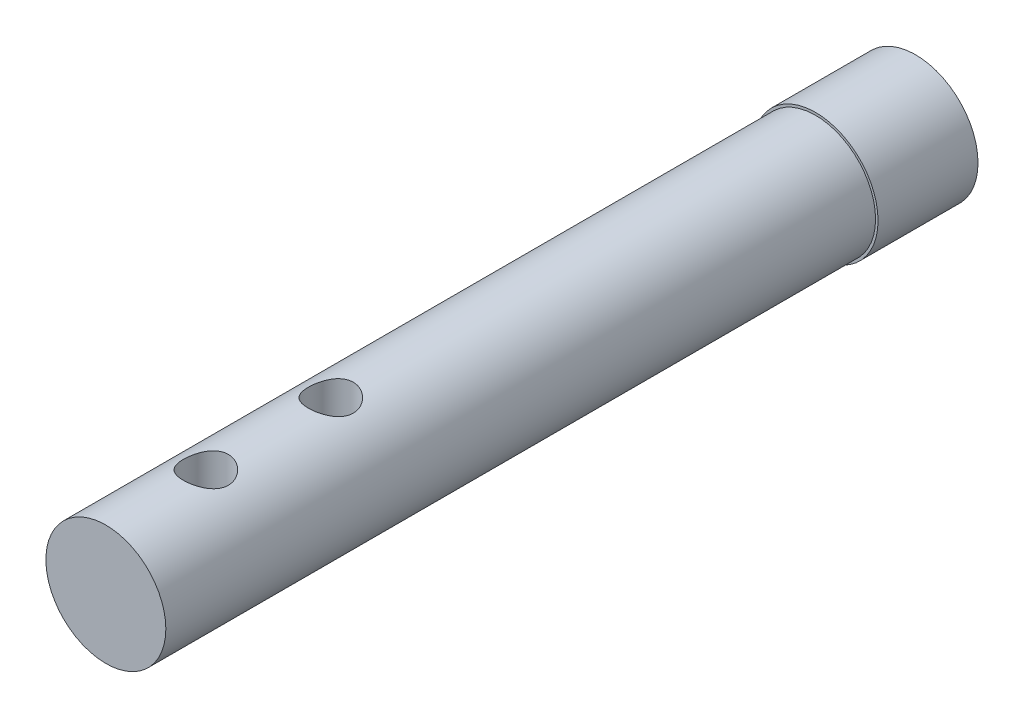
ISO-10303-21;
HEADER;
FILE_DESCRIPTION(('STEP AP214'),'2;1');
FILE_NAME('part.step','',(''),(''),'','','');
FILE_SCHEMA(('AUTOMOTIVE_DESIGN { 1 0 10303 214 1 1 1 1 }'));
ENDSEC;
DATA;
#1=APPLICATION_CONTEXT('core data for automotive mechanical design processes');
#2=APPLICATION_PROTOCOL_DEFINITION('international standard','automotive_design',2000,#1);
#3=PRODUCT_CONTEXT('',#1,'mechanical');
#4=PRODUCT('Part','Part','',(#3));
#5=PRODUCT_RELATED_PRODUCT_CATEGORY('part','',(#4));
#6=PRODUCT_DEFINITION_FORMATION('','',#4);
#7=PRODUCT_DEFINITION_CONTEXT('part definition',#1,'design');
#8=PRODUCT_DEFINITION('design','',#6,#7);
#9=PRODUCT_DEFINITION_SHAPE('','',#8);
#10=(LENGTH_UNIT() NAMED_UNIT(*) SI_UNIT(.MILLI.,.METRE.));
#11=(NAMED_UNIT(*) PLANE_ANGLE_UNIT() SI_UNIT($,.RADIAN.));
#12=(NAMED_UNIT(*) SI_UNIT($,.STERADIAN.) SOLID_ANGLE_UNIT());
#13=UNCERTAINTY_MEASURE_WITH_UNIT(LENGTH_MEASURE(1.E-05),#10,'distance_accuracy_value','');
#14=(GEOMETRIC_REPRESENTATION_CONTEXT(3) GLOBAL_UNCERTAINTY_ASSIGNED_CONTEXT((#13)) GLOBAL_UNIT_ASSIGNED_CONTEXT((#10,
#11,#12)) REPRESENTATION_CONTEXT('',''));
#15=CARTESIAN_POINT('',(0.,0.,0.));
#16=DIRECTION('',(0.,0.,1.));
#17=DIRECTION('',(1.,0.,0.));
#18=AXIS2_PLACEMENT_3D('',#15,#16,#17);
#19=CARTESIAN_POINT('',(0.,0.,35.));
#20=DIRECTION('',(0.,0.,-1.));
#21=DIRECTION('',(-1.,0.,0.));
#22=AXIS2_PLACEMENT_3D('',#19,#20,#21);
#23=CYLINDRICAL_SURFACE('',#22,12.5);
#24=CARTESIAN_POINT('',(0.,0.,35.));
#25=DIRECTION('',(0.,0.,1.));
#26=DIRECTION('',(1.,0.,0.));
#27=AXIS2_PLACEMENT_3D('',#24,#25,#26);
#28=CIRCLE('',#27,12.5);
#29=CARTESIAN_POINT('',(12.5,0.,35.));
#30=VERTEX_POINT('',#29);
#31=EDGE_CURVE('E44',#30,#30,#28,.T.);
#32=ORIENTED_EDGE('',*,*,#31,.F.);
#33=EDGE_LOOP('',(#32));
#34=FACE_BOUND('',#33,.T.);
#35=CARTESIAN_POINT('',(0.,0.,15.));
#36=DIRECTION('',(0.,0.,1.));
#37=DIRECTION('',(1.,0.,0.));
#38=AXIS2_PLACEMENT_3D('',#35,#36,#37);
#39=CIRCLE('',#38,12.5);
#40=CARTESIAN_POINT('',(12.5,0.,15.));
#41=VERTEX_POINT('',#40);
#42=EDGE_CURVE('E49',#41,#41,#39,.T.);
#43=ORIENTED_EDGE('',*,*,#42,.T.);
#44=EDGE_LOOP('',(#43));
#45=FACE_BOUND('',#44,.T.);
#46=ADVANCED_FACE('F32',(#34,#45),#23,.T.);
#47=CARTESIAN_POINT('',(0.,0.,35.));
#48=DIRECTION('',(0.,0.,1.));
#49=DIRECTION('',(1.,0.,0.));
#50=AXIS2_PLACEMENT_3D('',#47,#48,#49);
#51=PLANE('',#50);
#52=CARTESIAN_POINT('',(0.,0.,35.));
#53=DIRECTION('',(0.,0.,1.));
#54=DIRECTION('',(1.,0.,0.));
#55=AXIS2_PLACEMENT_3D('',#52,#53,#54);
#56=CIRCLE('',#55,12.);
#57=CARTESIAN_POINT('',(12.,0.,35.));
#58=VERTEX_POINT('',#57);
#59=EDGE_CURVE('E10',#58,#58,#56,.T.);
#60=ORIENTED_EDGE('',*,*,#59,.F.);
#61=EDGE_LOOP('',(#60));
#62=FACE_BOUND('',#61,.T.);
#63=ORIENTED_EDGE('',*,*,#31,.T.);
#64=EDGE_LOOP('',(#63));
#65=FACE_BOUND('',#64,.T.);
#66=ADVANCED_FACE('F88',(#62,#65),#51,.T.);
#67=CARTESIAN_POINT('',(0.,0.,15.));
#68=DIRECTION('',(0.,0.,1.));
#69=DIRECTION('',(1.,0.,0.));
#70=AXIS2_PLACEMENT_3D('',#67,#68,#69);
#71=PLANE('',#70);
#72=ORIENTED_EDGE('',*,*,#42,.F.);
#73=EDGE_LOOP('',(#72));
#74=FACE_BOUND('',#73,.T.);
#75=ADVANCED_FACE('F84',(#74),#71,.F.);
#76=CARTESIAN_POINT('',(0.,0.,177.));
#77=DIRECTION('',(0.,0.,-1.));
#78=DIRECTION('',(-1.,0.,0.));
#79=AXIS2_PLACEMENT_3D('',#76,#77,#78);
#80=CYLINDRICAL_SURFACE('',#79,12.);
#81=CARTESIAN_POINT('',(0.,-12.,136.5));
#82=CARTESIAN_POINT('',(0.121821920216141,-12.0000004149463,136.500000562589));
#83=CARTESIAN_POINT('',(0.243636002691335,-11.9981409348073,136.495049364538));
#84=CARTESIAN_POINT('',(0.486392423781216,-11.9907535477711,136.475293911887));
#85=CARTESIAN_POINT('',(0.607334471202253,-11.9852244680872,136.460486507286));
#86=CARTESIAN_POINT('',(0.84734738168719,-11.970649565472,136.421174413436));
#87=CARTESIAN_POINT('',(0.966419205128139,-11.9616056132673,136.396674882519));
#88=CARTESIAN_POINT('',(1.20195810401351,-11.9402382455256,136.33820576059));
#89=CARTESIAN_POINT('',(1.31842414848256,-11.9279135559973,136.304232490447));
#90=CARTESIAN_POINT('',(1.54765442429004,-11.9003384511568,136.227214849951));
#91=CARTESIAN_POINT('',(1.660426734491,-11.8850950009216,136.184192050998));
#92=CARTESIAN_POINT('',(1.88185705605878,-11.8520536393113,136.089393964957));
#93=CARTESIAN_POINT('',(1.99051352350808,-11.8342547811235,136.037615432482));
#94=CARTESIAN_POINT('',(2.30927279411985,-11.7776768093622,135.869731594457));
#95=CARTESIAN_POINT('',(2.51234231941558,-11.7356939966761,135.741018203868));
#96=CARTESIAN_POINT('',(2.90206977477989,-11.6455850212357,135.448156633399));
#97=CARTESIAN_POINT('',(3.08780172063125,-11.5972851945296,135.282840477992));
#98=CARTESIAN_POINT('',(3.42974311725175,-11.500801507554,134.923737421702));
#99=CARTESIAN_POINT('',(3.58594353155377,-11.4526176872201,134.729941838426));
#100=CARTESIAN_POINT('',(3.79764477617944,-11.3834841407686,134.417559070828));
#101=CARTESIAN_POINT('',(3.86547493196535,-11.3605705131175,134.307562616254));
#102=CARTESIAN_POINT('',(3.99157408188856,-11.3168804194774,134.081831512047));
#103=CARTESIAN_POINT('',(4.04984690983616,-11.2961030977882,133.966099187672));
#104=CARTESIAN_POINT('',(4.15634309619244,-11.257354412399,133.729634242611));
#105=CARTESIAN_POINT('',(4.20456527896397,-11.2393833770156,133.608901038945));
#106=CARTESIAN_POINT('',(4.29047551547084,-11.2068698048304,133.363350953977));
#107=CARTESIAN_POINT('',(4.32816865016454,-11.1923256148824,133.238536074949));
#108=CARTESIAN_POINT('',(4.3913383306389,-11.167687799886,132.990864282486));
#109=CARTESIAN_POINT('',(4.41724869222401,-11.1574374723367,132.868133574559));
#110=CARTESIAN_POINT('',(4.45874705417236,-11.1409189584307,132.620724885637));
#111=CARTESIAN_POINT('',(4.47433956871922,-11.1346490306496,132.496047780687));
#112=CARTESIAN_POINT('',(4.49504192825722,-11.1263077224061,132.245703904304));
#113=CARTESIAN_POINT('',(4.50015334189904,-11.124235713664,132.120037283793));
#114=CARTESIAN_POINT('',(4.4998396408155,-11.124362586323,131.868723898627));
#115=CARTESIAN_POINT('',(4.49441493477359,-11.1265613020677,131.74307713339));
#116=CARTESIAN_POINT('',(4.47373138181252,-11.1348931002806,131.500345583509));
#117=CARTESIAN_POINT('',(4.45908334347361,-11.1407817124043,131.383200175152));
#118=CARTESIAN_POINT('',(4.42068867776497,-11.1560711786316,131.150631735769));
#119=CARTESIAN_POINT('',(4.39693902815624,-11.1654731993557,131.035209290103));
#120=CARTESIAN_POINT('',(4.31234407385654,-11.1985472030748,130.692770983112));
#121=CARTESIAN_POINT('',(4.23813423625877,-11.2270952052095,130.469371280221));
#122=CARTESIAN_POINT('',(4.05490721343478,-11.294571324263,130.034132319446));
#123=CARTESIAN_POINT('',(3.94525805379047,-11.3336856090865,129.822591744781));
#124=CARTESIAN_POINT('',(3.69468362169031,-11.417826234714,129.420172587469));
#125=CARTESIAN_POINT('',(3.55374755073013,-11.4628546145386,129.229301172593));
#126=CARTESIAN_POINT('',(3.23345300799872,-11.5574411862383,128.860186122089));
#127=CARTESIAN_POINT('',(3.05214885027355,-11.607100429164,128.68365330368));
#128=CARTESIAN_POINT('',(2.66193788370924,-11.7027518394278,128.362986875577));
#129=CARTESIAN_POINT('',(2.45302684040981,-11.7487434424691,128.218858245353));
#130=CARTESIAN_POINT('',(2.00917028059687,-11.8327918458053,127.965208596408));
#131=CARTESIAN_POINT('',(1.77387213379261,-11.8707149483013,127.856257198474));
#132=CARTESIAN_POINT('',(1.28651055931183,-11.9333615492963,127.680052245027));
#133=CARTESIAN_POINT('',(1.03445463312943,-11.9580909097264,127.6127801694));
#134=CARTESIAN_POINT('',(0.535125728885333,-11.9905332973328,127.525131619306));
#135=CARTESIAN_POINT('',(0.288310863440802,-11.9990810722223,127.502452162351));
#136=CARTESIAN_POINT('',(-0.205717430518205,-12.0007768095524,127.497926826798));
#137=CARTESIAN_POINT('',(-0.452930758520928,-11.9939281862917,127.516071894972));
#138=CARTESIAN_POINT('',(-0.930786126866782,-11.9661512982893,127.590930073153));
#139=CARTESIAN_POINT('',(-1.16169991458787,-11.9457741475744,127.646134437354));
#140=CARTESIAN_POINT('',(-1.61082533431484,-11.8935442940439,127.791558411525));
#141=CARTESIAN_POINT('',(-1.82903531000968,-11.8616900987367,127.881782575637));
#142=CARTESIAN_POINT('',(-2.25374302875422,-11.7884888040033,128.097558494317));
#143=CARTESIAN_POINT('',(-2.45970824228689,-11.7468902777666,128.224070377444));
#144=CARTESIAN_POINT('',(-2.8481791439392,-11.6587998753534,128.50775712078));
#145=CARTESIAN_POINT('',(-3.03067612982123,-11.6123061955645,128.664943301224));
#146=CARTESIAN_POINT('',(-3.37808840855275,-11.516200958323,129.016201253386));
#147=CARTESIAN_POINT('',(-3.54136933947529,-11.4665650100461,129.211883953797));
#148=CARTESIAN_POINT('',(-3.8331467865608,-11.372360357102,129.628996752467));
#149=CARTESIAN_POINT('',(-3.96164017919756,-11.3277921076647,129.850429160209));
#150=CARTESIAN_POINT('',(-4.12541953452076,-11.2687303690453,130.197922796397));
#151=CARTESIAN_POINT('',(-4.17527938653559,-11.2503030894951,130.316647329586));
#152=CARTESIAN_POINT('',(-4.26475585416723,-11.2166905930926,130.558323845116));
#153=CARTESIAN_POINT('',(-4.30437682733462,-11.2015039975232,130.681274003754));
#154=CARTESIAN_POINT('',(-4.37296242168506,-11.1749073223601,130.930466472104));
#155=CARTESIAN_POINT('',(-4.40193024471254,-11.163496108165,131.056707780413));
#156=CARTESIAN_POINT('',(-4.44890662829911,-11.1448585297206,131.31151813959));
#157=CARTESIAN_POINT('',(-4.46691595320739,-11.1376318736025,131.440087027466));
#158=CARTESIAN_POINT('',(-4.4909611175474,-11.1279568107625,131.690138338187));
#159=CARTESIAN_POINT('',(-4.4976937576826,-11.1252304971503,131.811543515748));
#160=CARTESIAN_POINT('',(-4.50131029580419,-11.1237678185175,132.054568299403));
#161=CARTESIAN_POINT('',(-4.49819087218451,-11.1250327991546,132.176187963996));
#162=CARTESIAN_POINT('',(-4.48213280066959,-11.131512007523,132.418611778483));
#163=CARTESIAN_POINT('',(-4.46919877710471,-11.1367243753675,132.539416285416));
#164=CARTESIAN_POINT('',(-4.4336489114592,-11.150924738849,132.779410101132));
#165=CARTESIAN_POINT('',(-4.41102942370239,-11.1599141561698,132.898598784262));
#166=CARTESIAN_POINT('',(-4.35718066722756,-11.1810458214159,133.130811506595));
#167=CARTESIAN_POINT('',(-4.32623979458421,-11.1930817833517,133.243912139277));
#168=CARTESIAN_POINT('',(-4.25575591081443,-11.220069483486,133.467056271898));
#169=CARTESIAN_POINT('',(-4.21620988547499,-11.23502224319,133.577098685333));
#170=CARTESIAN_POINT('',(-4.08512625929658,-11.2836374066331,133.901595505612));
#171=CARTESIAN_POINT('',(-3.98110253179987,-11.3210734609741,134.110592817196));
#172=CARTESIAN_POINT('',(-3.73655960136618,-11.4041928736043,134.519509886323));
#173=CARTESIAN_POINT('',(-3.59441315608531,-11.4502056852775,134.718379513829));
#174=CARTESIAN_POINT('',(-3.28000639093493,-11.5441926723435,135.090437563583));
#175=CARTESIAN_POINT('',(-3.10773650011229,-11.5921674673836,135.263617791262));
#176=CARTESIAN_POINT('',(-2.82485495768736,-11.6632064644304,135.505245875948));
#177=CARTESIAN_POINT('',(-2.72355677041139,-11.6873329442322,135.584523984934));
#178=CARTESIAN_POINT('',(-2.5143325103599,-11.7341212355869,135.734254321495));
#179=CARTESIAN_POINT('',(-2.40640888366377,-11.7567835814237,135.804709777492));
#180=CARTESIAN_POINT('',(-2.18454509687348,-11.8000231112314,135.936294134108));
#181=CARTESIAN_POINT('',(-2.0706017726869,-11.8205991816831,135.997418062869));
#182=CARTESIAN_POINT('',(-1.83755175113718,-11.8590616275344,136.109759993606));
#183=CARTESIAN_POINT('',(-1.71844727331547,-11.8769491446375,136.16098220304));
#184=CARTESIAN_POINT('',(-1.47053797162902,-11.9102407175975,136.255097964792));
#185=CARTESIAN_POINT('',(-1.34153686175291,-11.9255011706843,136.297526838323));
#186=CARTESIAN_POINT('',(-1.07989915577463,-11.9520331999052,136.370612963128));
#187=CARTESIAN_POINT('',(-0.947264179674959,-11.9633065233273,136.401275371348));
#188=CARTESIAN_POINT('',(-0.679492491904587,-11.9814979813589,136.450485060083));
#189=CARTESIAN_POINT('',(-0.544356226207077,-11.9884168847946,136.469034479318));
#190=CARTESIAN_POINT('',(-0.272809934790554,-11.9976674031164,136.493790938277));
#191=CARTESIAN_POINT('',(-0.136400054481803,-11.9999995353981,136.499999370088));
#192=CARTESIAN_POINT('',(0.,-12.,136.5));
#193=B_SPLINE_CURVE_WITH_KNOTS('',3,(#81,#82,#83,#84,#85,#86,#87,#88,#89,#90,#91,#92,#93,#94,
#95,#96,#97,#98,#99,#100,#101,#102,#103,#104,#105,#106,#107,#108,#109,#110,#111,#112,#113,#114,
#115,#116,#117,#118,#119,#120,#121,#122,#123,#124,#125,#126,#127,#128,#129,#130,#131,#132,#133,
#134,#135,#136,#137,#138,#139,#140,#141,#142,#143,#144,#145,#146,#147,#148,#149,#150,#151,#152,
#153,#154,#155,#156,#157,#158,#159,#160,#161,#162,#163,#164,#165,#166,#167,#168,#169,#170,#171,
#172,#173,#174,#175,#176,#177,#178,#179,#180,#181,#182,#183,#184,#185,#186,#187,#188,#189,#190,
#191,#192),.UNSPECIFIED.,.T.,.F.,(4,2,2,2,2,2,2,2,2,2,2,2,2,2,2,2,2,2,2,2,2,2,2,2,2,2,2,2,2,2,2,
2,2,2,2,2,2,2,2,2,2,2,2,2,2,2,2,2,2,2,2,2,2,2,2,4),(0.,0.365338024506953,0.730792865566527,
1.09605346575199,1.46145611308566,1.82599742407274,2.19067415273862,2.91947018392637,
3.67616860257938,4.43309819286657,4.82642681378567,5.21959726757261,5.6128136852447,
6.00584002102328,6.38291145568139,6.75981780772976,7.13666774608809,7.5135030671805,
7.86768402280125,8.22198268815959,8.92994647641833,9.65130458621122,10.3729120569284,
11.1430169346751,11.9132400717527,12.6953735931829,13.477159325566,14.2173829236784,
14.9574423863163,15.6690654723159,16.3807811322343,17.1134089903886,17.8463077351967,
18.6217279182704,19.3972177022049,19.7870381951626,20.1766925107005,20.5662296182681,
20.9557395527225,21.3201489316714,21.6846811837187,22.0490417862154,22.4135396573091,
22.7667469946614,23.1200782532196,23.8262105801188,24.5693581369517,25.3127422403355,
25.7049754844993,26.0970647789657,26.4893622558027,26.8814926686161,27.2908478409866,
27.7000233978563,28.1091266894863,28.5181838309154),.UNSPECIFIED.);
#194=CARTESIAN_POINT('',(0.,-12.,136.5));
#195=VERTEX_POINT('',#194);
#196=EDGE_CURVE('E35',#195,#195,#193,.T.);
#197=ORIENTED_EDGE('',*,*,#196,.T.);
#198=EDGE_LOOP('',(#197));
#199=FACE_BOUND('',#198,.T.);
#200=CARTESIAN_POINT('',(0.,12.,136.5));
#201=CARTESIAN_POINT('',(-0.121821920216148,12.0000004149463,136.500000562589));
#202=CARTESIAN_POINT('',(-0.243636002691342,11.9981409348073,136.495049364538));
#203=CARTESIAN_POINT('',(-0.486392423781223,11.9907535477711,136.475293911887));
#204=CARTESIAN_POINT('',(-0.60733447120226,11.9852244680872,136.460486507286));
#205=CARTESIAN_POINT('',(-0.847347381687195,11.970649565472,136.421174413436));
#206=CARTESIAN_POINT('',(-0.966419205128142,11.9616056132673,136.396674882519));
#207=CARTESIAN_POINT('',(-1.20195810401351,11.9402382455256,136.33820576059));
#208=CARTESIAN_POINT('',(-1.31842414848256,11.9279135559973,136.304232490447));
#209=CARTESIAN_POINT('',(-1.54765442429004,11.9003384511568,136.227214849951));
#210=CARTESIAN_POINT('',(-1.66042673449101,11.8850950009216,136.184192050998));
#211=CARTESIAN_POINT('',(-1.88185705605879,11.8520536393113,136.089393964957));
#212=CARTESIAN_POINT('',(-1.99051352350809,11.8342547811235,136.037615432482));
#213=CARTESIAN_POINT('',(-2.30927279411986,11.7776768093622,135.869731594457));
#214=CARTESIAN_POINT('',(-2.51234231941558,11.7356939966761,135.741018203868));
#215=CARTESIAN_POINT('',(-2.90206977477989,11.6455850212357,135.448156633399));
#216=CARTESIAN_POINT('',(-3.08780172063126,11.5972851945296,135.282840477992));
#217=CARTESIAN_POINT('',(-3.42974311725176,11.500801507554,134.923737421702));
#218=CARTESIAN_POINT('',(-3.58594353155377,11.4526176872201,134.729941838426));
#219=CARTESIAN_POINT('',(-3.79764477617945,11.3834841407686,134.417559070828));
#220=CARTESIAN_POINT('',(-3.86547493196536,11.3605705131175,134.307562616254));
#221=CARTESIAN_POINT('',(-3.99157408188856,11.3168804194774,134.081831512047));
#222=CARTESIAN_POINT('',(-4.04984690983617,11.2961030977882,133.966099187672));
#223=CARTESIAN_POINT('',(-4.15634309619245,11.257354412399,133.729634242611));
#224=CARTESIAN_POINT('',(-4.20456527896398,11.2393833770156,133.608901038945));
#225=CARTESIAN_POINT('',(-4.29047551547085,11.2068698048304,133.363350953977));
#226=CARTESIAN_POINT('',(-4.32816865016455,11.1923256148824,133.238536074949));
#227=CARTESIAN_POINT('',(-4.3913383306389,11.167687799886,132.990864282486));
#228=CARTESIAN_POINT('',(-4.41724869222402,11.1574374723367,132.868133574559));
#229=CARTESIAN_POINT('',(-4.45874705417237,11.1409189584307,132.620724885637));
#230=CARTESIAN_POINT('',(-4.47433956871923,11.1346490306496,132.496047780687));
#231=CARTESIAN_POINT('',(-4.49504192825722,11.1263077224061,132.245703904304));
#232=CARTESIAN_POINT('',(-4.50015334189905,11.124235713664,132.120037283793));
#233=CARTESIAN_POINT('',(-4.49983964081551,11.124362586323,131.868723898627));
#234=CARTESIAN_POINT('',(-4.4944149347736,11.1265613020677,131.74307713339));
#235=CARTESIAN_POINT('',(-4.47373138181252,11.1348931002806,131.500345583509));
#236=CARTESIAN_POINT('',(-4.45908334347362,11.1407817124043,131.383200175152));
#237=CARTESIAN_POINT('',(-4.42068867776498,11.1560711786316,131.150631735769));
#238=CARTESIAN_POINT('',(-4.39693902815624,11.1654731993557,131.035209290103));
#239=CARTESIAN_POINT('',(-4.31234407385655,11.1985472030748,130.692770983112));
#240=CARTESIAN_POINT('',(-4.23813423625877,11.2270952052095,130.469371280221));
#241=CARTESIAN_POINT('',(-4.05490721343479,11.294571324263,130.034132319446));
#242=CARTESIAN_POINT('',(-3.94525805379048,11.3336856090865,129.822591744781));
#243=CARTESIAN_POINT('',(-3.69468362169032,11.417826234714,129.420172587469));
#244=CARTESIAN_POINT('',(-3.55374755073014,11.4628546145386,129.229301172593));
#245=CARTESIAN_POINT('',(-3.23345300799872,11.5574411862383,128.860186122089));
#246=CARTESIAN_POINT('',(-3.05214885027355,11.607100429164,128.68365330368));
#247=CARTESIAN_POINT('',(-2.66193788370925,11.7027518394278,128.362986875577));
#248=CARTESIAN_POINT('',(-2.45302684040981,11.7487434424691,128.218858245353));
#249=CARTESIAN_POINT('',(-2.00917028059688,11.8327918458053,127.965208596408));
#250=CARTESIAN_POINT('',(-1.77387213379261,11.8707149483013,127.856257198474));
#251=CARTESIAN_POINT('',(-1.28651055931184,11.9333615492963,127.680052245027));
#252=CARTESIAN_POINT('',(-1.03445463312944,11.9580909097264,127.6127801694));
#253=CARTESIAN_POINT('',(-0.53512572888534,11.9905332973328,127.525131619306));
#254=CARTESIAN_POINT('',(-0.28831086344081,11.9990810722223,127.502452162351));
#255=CARTESIAN_POINT('',(0.205717430518197,12.0007768095524,127.497926826798));
#256=CARTESIAN_POINT('',(0.45293075852092,11.9939281862917,127.516071894972));
#257=CARTESIAN_POINT('',(0.930786126866774,11.9661512982893,127.590930073153));
#258=CARTESIAN_POINT('',(1.16169991458787,11.9457741475744,127.646134437354));
#259=CARTESIAN_POINT('',(1.61082533431484,11.8935442940439,127.791558411525));
#260=CARTESIAN_POINT('',(1.82903531000967,11.8616900987367,127.881782575637));
#261=CARTESIAN_POINT('',(2.25374302875422,11.7884888040033,128.097558494317));
#262=CARTESIAN_POINT('',(2.45970824228691,11.7468902777666,128.224070377444));
#263=CARTESIAN_POINT('',(2.84817914393921,11.6587998753534,128.50775712078));
#264=CARTESIAN_POINT('',(3.03067612982123,11.6123061955645,128.664943301224));
#265=CARTESIAN_POINT('',(3.37808840855274,11.516200958323,129.016201253386));
#266=CARTESIAN_POINT('',(3.54136933947528,11.4665650100462,129.211883953797));
#267=CARTESIAN_POINT('',(3.8331467865608,11.372360357102,129.628996752467));
#268=CARTESIAN_POINT('',(3.96164017919755,11.3277921076647,129.850429160209));
#269=CARTESIAN_POINT('',(4.12541953452075,11.2687303690453,130.197922796397));
#270=CARTESIAN_POINT('',(4.17527938653558,11.2503030894951,130.316647329586));
#271=CARTESIAN_POINT('',(4.26475585416722,11.2166905930926,130.558323845116));
#272=CARTESIAN_POINT('',(4.30437682733461,11.2015039975232,130.681274003754));
#273=CARTESIAN_POINT('',(4.37296242168505,11.1749073223601,130.930466472104));
#274=CARTESIAN_POINT('',(4.40193024471254,11.163496108165,131.056707780413));
#275=CARTESIAN_POINT('',(4.44890662829911,11.1448585297206,131.31151813959));
#276=CARTESIAN_POINT('',(4.46691595320738,11.1376318736025,131.440087027466));
#277=CARTESIAN_POINT('',(4.49096111754739,11.1279568107625,131.690138338187));
#278=CARTESIAN_POINT('',(4.49769375768259,11.1252304971503,131.811543515748));
#279=CARTESIAN_POINT('',(4.50131029580418,11.1237678185175,132.054568299403));
#280=CARTESIAN_POINT('',(4.4981908721845,11.1250327991546,132.176187963996));
#281=CARTESIAN_POINT('',(4.48213280066958,11.131512007523,132.418611778483));
#282=CARTESIAN_POINT('',(4.4691987771047,11.1367243753675,132.539416285416));
#283=CARTESIAN_POINT('',(4.4336489114592,11.150924738849,132.779410101132));
#284=CARTESIAN_POINT('',(4.41102942370238,11.1599141561698,132.898598784262));
#285=CARTESIAN_POINT('',(4.35718066722755,11.1810458214159,133.130811506595));
#286=CARTESIAN_POINT('',(4.3262397945842,11.1930817833517,133.243912139277));
#287=CARTESIAN_POINT('',(4.25575591081442,11.220069483486,133.467056271898));
#288=CARTESIAN_POINT('',(4.21620988547499,11.23502224319,133.577098685333));
#289=CARTESIAN_POINT('',(4.08512625929658,11.2836374066331,133.901595505612));
#290=CARTESIAN_POINT('',(3.98110253179987,11.3210734609741,134.110592817196));
#291=CARTESIAN_POINT('',(3.73655960136618,11.4041928736043,134.519509886323));
#292=CARTESIAN_POINT('',(3.5944131560853,11.4502056852775,134.718379513829));
#293=CARTESIAN_POINT('',(3.28000639093493,11.5441926723435,135.090437563583));
#294=CARTESIAN_POINT('',(3.10773650011228,11.5921674673837,135.263617791262));
#295=CARTESIAN_POINT('',(2.82485495768736,11.6632064644304,135.505245875948));
#296=CARTESIAN_POINT('',(2.72355677041138,11.6873329442322,135.584523984934));
#297=CARTESIAN_POINT('',(2.51433251035989,11.7341212355869,135.734254321495));
#298=CARTESIAN_POINT('',(2.40640888366376,11.7567835814237,135.804709777492));
#299=CARTESIAN_POINT('',(2.18454509687347,11.8000231112314,135.936294134108));
#300=CARTESIAN_POINT('',(2.0706017726869,11.8205991816831,135.997418062869));
#301=CARTESIAN_POINT('',(1.83755175113717,11.8590616275344,136.109759993606));
#302=CARTESIAN_POINT('',(1.71844727331546,11.8769491446375,136.16098220304));
#303=CARTESIAN_POINT('',(1.47053797162901,11.9102407175975,136.255097964792));
#304=CARTESIAN_POINT('',(1.3415368617529,11.9255011706843,136.297526838323));
#305=CARTESIAN_POINT('',(1.07989915577463,11.9520331999052,136.370612963128));
#306=CARTESIAN_POINT('',(0.947264179674951,11.9633065233273,136.401275371348));
#307=CARTESIAN_POINT('',(0.67949249190458,11.9814979813589,136.450485060083));
#308=CARTESIAN_POINT('',(0.54435622620707,11.9884168847946,136.469034479318));
#309=CARTESIAN_POINT('',(0.272809934790547,11.9976674031164,136.493790938277));
#310=CARTESIAN_POINT('',(0.136400054481796,11.9999995353981,136.499999370088));
#311=CARTESIAN_POINT('',(0.,12.,136.5));
#312=B_SPLINE_CURVE_WITH_KNOTS('',3,(#200,#201,#202,#203,#204,#205,#206,#207,#208,#209,#210,
#211,#212,#213,#214,#215,#216,#217,#218,#219,#220,#221,#222,#223,#224,#225,#226,#227,#228,#229,
#230,#231,#232,#233,#234,#235,#236,#237,#238,#239,#240,#241,#242,#243,#244,#245,#246,#247,#248,
#249,#250,#251,#252,#253,#254,#255,#256,#257,#258,#259,#260,#261,#262,#263,#264,#265,#266,#267,
#268,#269,#270,#271,#272,#273,#274,#275,#276,#277,#278,#279,#280,#281,#282,#283,#284,#285,#286,
#287,#288,#289,#290,#291,#292,#293,#294,#295,#296,#297,#298,#299,#300,#301,#302,#303,#304,#305,
#306,#307,#308,#309,#310,#311),.UNSPECIFIED.,.T.,.F.,(4,2,2,2,2,2,2,2,2,2,2,2,2,2,2,2,2,2,2,2,2,
2,2,2,2,2,2,2,2,2,2,2,2,2,2,2,2,2,2,2,2,2,2,2,2,2,2,2,2,2,2,2,2,2,2,4),(0.,0.365338024506954,
0.730792865566528,1.09605346575198,1.46145611308566,1.82599742407274,2.19067415273862,
2.91947018392637,3.67616860257938,4.43309819286657,4.82642681378567,5.21959726757261,
5.6128136852447,6.00584002102328,6.38291145568139,6.75981780772976,7.13666774608809,
7.5135030671805,7.86768402280125,8.22198268815959,8.92994647641833,9.65130458621122,
10.3729120569284,11.1430169346751,11.9132400717527,12.6953735931829,13.477159325566,
14.2173829236784,14.9574423863163,15.6690654723159,16.3807811322343,17.1134089903887,
17.8463077351967,18.6217279182704,19.3972177022049,19.7870381951626,20.1766925107005,
20.5662296182681,20.9557395527225,21.3201489316714,21.6846811837187,22.0490417862154,
22.4135396573091,22.7667469946614,23.1200782532196,23.8262105801188,24.5693581369517,
25.3127422403355,25.7049754844993,26.0970647789657,26.4893622558027,26.8814926686162,
27.2908478409866,27.7000233978563,28.1091266894863,28.5181838309154),.UNSPECIFIED.);
#313=CARTESIAN_POINT('',(0.,12.,136.5));
#314=VERTEX_POINT('',#313);
#315=EDGE_CURVE('E145',#314,#314,#312,.T.);
#316=ORIENTED_EDGE('',*,*,#315,.T.);
#317=EDGE_LOOP('',(#316));
#318=FACE_BOUND('',#317,.T.);
#319=CARTESIAN_POINT('',(0.,-12.,161.5));
#320=CARTESIAN_POINT('',(0.121821920216141,-12.0000004149463,161.500000562589));
#321=CARTESIAN_POINT('',(0.243636002691335,-11.9981409348073,161.495049364538));
#322=CARTESIAN_POINT('',(0.486392423781216,-11.9907535477711,161.475293911887));
#323=CARTESIAN_POINT('',(0.607334471202253,-11.9852244680872,161.460486507286));
#324=CARTESIAN_POINT('',(0.84734738168719,-11.970649565472,161.421174413436));
#325=CARTESIAN_POINT('',(0.966419205128139,-11.9616056132673,161.396674882519));
#326=CARTESIAN_POINT('',(1.20195810401351,-11.9402382455256,161.33820576059));
#327=CARTESIAN_POINT('',(1.31842414848256,-11.9279135559973,161.304232490447));
#328=CARTESIAN_POINT('',(1.54765442429003,-11.9003384511568,161.227214849951));
#329=CARTESIAN_POINT('',(1.660426734491,-11.8850950009216,161.184192050998));
#330=CARTESIAN_POINT('',(1.88185705605878,-11.8520536393113,161.089393964957));
#331=CARTESIAN_POINT('',(1.99051352350808,-11.8342547811235,161.037615432482));
#332=CARTESIAN_POINT('',(2.30927279411985,-11.7776768093622,160.869731594457));
#333=CARTESIAN_POINT('',(2.51234231941558,-11.7356939966761,160.741018203868));
#334=CARTESIAN_POINT('',(2.90206977477989,-11.6455850212357,160.448156633399));
#335=CARTESIAN_POINT('',(3.08780172063126,-11.5972851945296,160.282840477992));
#336=CARTESIAN_POINT('',(3.42974311725176,-11.500801507554,159.923737421702));
#337=CARTESIAN_POINT('',(3.58594353155377,-11.4526176872201,159.729941838426));
#338=CARTESIAN_POINT('',(3.79764477617944,-11.3834841407686,159.417559070828));
#339=CARTESIAN_POINT('',(3.86547493196534,-11.3605705131175,159.307562616254));
#340=CARTESIAN_POINT('',(3.99157408188855,-11.3168804194774,159.081831512047));
#341=CARTESIAN_POINT('',(4.04984690983615,-11.2961030977882,158.966099187672));
#342=CARTESIAN_POINT('',(4.15634309619243,-11.2573544123991,158.729634242611));
#343=CARTESIAN_POINT('',(4.20456527896396,-11.2393833770156,158.608901038945));
#344=CARTESIAN_POINT('',(4.29047551547084,-11.2068698048304,158.363350953977));
#345=CARTESIAN_POINT('',(4.32816865016454,-11.1923256148824,158.238536074949));
#346=CARTESIAN_POINT('',(4.39133833063889,-11.167687799886,157.990864282486));
#347=CARTESIAN_POINT('',(4.41724869222401,-11.1574374723367,157.868133574559));
#348=CARTESIAN_POINT('',(4.45874705417236,-11.1409189584307,157.620724885637));
#349=CARTESIAN_POINT('',(4.47433956871922,-11.1346490306496,157.496047780687));
#350=CARTESIAN_POINT('',(4.49504192825721,-11.1263077224061,157.245703904304));
#351=CARTESIAN_POINT('',(4.50015334189904,-11.124235713664,157.120037283793));
#352=CARTESIAN_POINT('',(4.4998396408155,-11.124362586323,156.868723898627));
#353=CARTESIAN_POINT('',(4.49441493477359,-11.1265613020677,156.74307713339));
#354=CARTESIAN_POINT('',(4.47373138181252,-11.1348931002806,156.500345583509));
#355=CARTESIAN_POINT('',(4.45908334347362,-11.1407817124043,156.383200175152));
#356=CARTESIAN_POINT('',(4.42068867776498,-11.1560711786316,156.150631735769));
#357=CARTESIAN_POINT('',(4.39693902815625,-11.1654731993557,156.035209290103));
#358=CARTESIAN_POINT('',(4.31234407385655,-11.1985472030748,155.692770983112));
#359=CARTESIAN_POINT('',(4.23813423625877,-11.2270952052095,155.469371280221));
#360=CARTESIAN_POINT('',(4.05490721343478,-11.294571324263,155.034132319446));
#361=CARTESIAN_POINT('',(3.94525805379047,-11.3336856090865,154.822591744781));
#362=CARTESIAN_POINT('',(3.69468362169031,-11.417826234714,154.420172587469));
#363=CARTESIAN_POINT('',(3.55374755073013,-11.4628546145386,154.229301172593));
#364=CARTESIAN_POINT('',(3.23345300799872,-11.5574411862383,153.860186122089));
#365=CARTESIAN_POINT('',(3.05214885027355,-11.607100429164,153.68365330368));
#366=CARTESIAN_POINT('',(2.66193788370924,-11.7027518394278,153.362986875577));
#367=CARTESIAN_POINT('',(2.45302684040981,-11.7487434424691,153.218858245353));
#368=CARTESIAN_POINT('',(2.00917028059687,-11.8327918458053,152.965208596408));
#369=CARTESIAN_POINT('',(1.77387213379261,-11.8707149483013,152.856257198474));
#370=CARTESIAN_POINT('',(1.28651055931183,-11.9333615492963,152.680052245027));
#371=CARTESIAN_POINT('',(1.03445463312943,-11.9580909097264,152.6127801694));
#372=CARTESIAN_POINT('',(0.535125728885332,-11.9905332973328,152.525131619306));
#373=CARTESIAN_POINT('',(0.288310863440802,-11.9990810722223,152.502452162351));
#374=CARTESIAN_POINT('',(-0.205717430518205,-12.0007768095524,152.497926826798));
#375=CARTESIAN_POINT('',(-0.452930758520928,-11.9939281862917,152.516071894972));
#376=CARTESIAN_POINT('',(-0.930786126866782,-11.9661512982893,152.590930073153));
#377=CARTESIAN_POINT('',(-1.16169991458787,-11.9457741475744,152.646134437354));
#378=CARTESIAN_POINT('',(-1.61082533431484,-11.8935442940439,152.791558411525));
#379=CARTESIAN_POINT('',(-1.82903531000967,-11.8616900987367,152.881782575637));
#380=CARTESIAN_POINT('',(-2.25374302875423,-11.7884888040033,153.097558494317));
#381=CARTESIAN_POINT('',(-2.4597082422869,-11.7468902777666,153.224070377444));
#382=CARTESIAN_POINT('',(-2.84817914393921,-11.6587998753534,153.50775712078));
#383=CARTESIAN_POINT('',(-3.03067612982124,-11.6123061955645,153.664943301224));
#384=CARTESIAN_POINT('',(-3.37808840855274,-11.516200958323,154.016201253386));
#385=CARTESIAN_POINT('',(-3.54136933947528,-11.4665650100462,154.211883953797));
#386=CARTESIAN_POINT('',(-3.83314678656079,-11.372360357102,154.628996752467));
#387=CARTESIAN_POINT('',(-3.96164017919755,-11.3277921076647,154.850429160209));
#388=CARTESIAN_POINT('',(-4.12541953452075,-11.2687303690453,155.197922796397));
#389=CARTESIAN_POINT('',(-4.17527938653558,-11.2503030894951,155.316647329586));
#390=CARTESIAN_POINT('',(-4.26475585416722,-11.2166905930926,155.558323845116));
#391=CARTESIAN_POINT('',(-4.30437682733461,-11.2015039975232,155.681274003754));
#392=CARTESIAN_POINT('',(-4.37296242168505,-11.1749073223601,155.930466472104));
#393=CARTESIAN_POINT('',(-4.40193024471254,-11.163496108165,156.056707780413));
#394=CARTESIAN_POINT('',(-4.44890662829911,-11.1448585297206,156.31151813959));
#395=CARTESIAN_POINT('',(-4.46691595320738,-11.1376318736025,156.440087027466));
#396=CARTESIAN_POINT('',(-4.4909611175474,-11.1279568107625,156.690138338187));
#397=CARTESIAN_POINT('',(-4.4976937576826,-11.1252304971503,156.811543515748));
#398=CARTESIAN_POINT('',(-4.50131029580419,-11.1237678185175,157.054568299403));
#399=CARTESIAN_POINT('',(-4.49819087218451,-11.1250327991546,157.176187963996));
#400=CARTESIAN_POINT('',(-4.48213280066959,-11.131512007523,157.418611778483));
#401=CARTESIAN_POINT('',(-4.46919877710471,-11.1367243753675,157.539416285416));
#402=CARTESIAN_POINT('',(-4.4336489114592,-11.150924738849,157.779410101132));
#403=CARTESIAN_POINT('',(-4.41102942370239,-11.1599141561698,157.898598784262));
#404=CARTESIAN_POINT('',(-4.35718066722756,-11.1810458214159,158.130811506595));
#405=CARTESIAN_POINT('',(-4.3262397945842,-11.1930817833517,158.243912139277));
#406=CARTESIAN_POINT('',(-4.25575591081442,-11.220069483486,158.467056271898));
#407=CARTESIAN_POINT('',(-4.21620988547499,-11.23502224319,158.577098685333));
#408=CARTESIAN_POINT('',(-4.08512625929658,-11.2836374066331,158.901595505612));
#409=CARTESIAN_POINT('',(-3.98110253179987,-11.3210734609741,159.110592817196));
#410=CARTESIAN_POINT('',(-3.73655960136618,-11.4041928736043,159.519509886323));
#411=CARTESIAN_POINT('',(-3.5944131560853,-11.4502056852775,159.718379513829));
#412=CARTESIAN_POINT('',(-3.28000639093493,-11.5441926723435,160.090437563583));
#413=CARTESIAN_POINT('',(-3.10773650011228,-11.5921674673836,160.263617791262));
#414=CARTESIAN_POINT('',(-2.82485495768736,-11.6632064644304,160.505245875948));
#415=CARTESIAN_POINT('',(-2.72355677041138,-11.6873329442322,160.584523984934));
#416=CARTESIAN_POINT('',(-2.51433251035989,-11.7341212355869,160.734254321495));
#417=CARTESIAN_POINT('',(-2.40640888366377,-11.7567835814237,160.804709777492));
#418=CARTESIAN_POINT('',(-2.18454509687348,-11.8000231112314,160.936294134108));
#419=CARTESIAN_POINT('',(-2.0706017726869,-11.8205991816831,160.997418062869));
#420=CARTESIAN_POINT('',(-1.83755175113717,-11.8590616275344,161.109759993606));
#421=CARTESIAN_POINT('',(-1.71844727331546,-11.8769491446375,161.16098220304));
#422=CARTESIAN_POINT('',(-1.47053797162902,-11.9102407175975,161.255097964792));
#423=CARTESIAN_POINT('',(-1.34153686175291,-11.9255011706843,161.297526838323));
#424=CARTESIAN_POINT('',(-1.07989915577463,-11.9520331999052,161.370612963128));
#425=CARTESIAN_POINT('',(-0.947264179674955,-11.9633065233273,161.401275371348));
#426=CARTESIAN_POINT('',(-0.679492491904584,-11.9814979813589,161.450485060083));
#427=CARTESIAN_POINT('',(-0.544356226207075,-11.9884168847946,161.469034479318));
#428=CARTESIAN_POINT('',(-0.272809934790553,-11.9976674031164,161.493790938277));
#429=CARTESIAN_POINT('',(-0.136400054481803,-11.9999995353981,161.499999370088));
#430=CARTESIAN_POINT('',(0.,-12.,161.5));
#431=B_SPLINE_CURVE_WITH_KNOTS('',3,(#319,#320,#321,#322,#323,#324,#325,#326,#327,#328,#329,
#330,#331,#332,#333,#334,#335,#336,#337,#338,#339,#340,#341,#342,#343,#344,#345,#346,#347,#348,
#349,#350,#351,#352,#353,#354,#355,#356,#357,#358,#359,#360,#361,#362,#363,#364,#365,#366,#367,
#368,#369,#370,#371,#372,#373,#374,#375,#376,#377,#378,#379,#380,#381,#382,#383,#384,#385,#386,
#387,#388,#389,#390,#391,#392,#393,#394,#395,#396,#397,#398,#399,#400,#401,#402,#403,#404,#405,
#406,#407,#408,#409,#410,#411,#412,#413,#414,#415,#416,#417,#418,#419,#420,#421,#422,#423,#424,
#425,#426,#427,#428,#429,#430),.UNSPECIFIED.,.T.,.F.,(4,2,2,2,2,2,2,2,2,2,2,2,2,2,2,2,2,2,2,2,2,
2,2,2,2,2,2,2,2,2,2,2,2,2,2,2,2,2,2,2,2,2,2,2,2,2,2,2,2,2,2,2,2,2,2,4),(0.,0.365338024506953,
0.730792865566527,1.09605346575199,1.46145611308566,1.82599742407273,2.19067415273862,
2.91947018392637,3.67616860257939,4.43309819286657,4.82642681378564,5.21959726757258,
5.61281368524467,6.00584002102328,6.38291145568136,6.75981780772973,7.13666774608807,
7.51350306718051,7.86768402280119,8.22198268815956,8.92994647641833,9.65130458621122,
10.3729120569284,11.1430169346751,11.9132400717527,12.6953735931829,13.477159325566,
14.2173829236784,14.9574423863163,15.6690654723159,16.3807811322343,17.1134089903886,
17.8463077351967,18.6217279182704,19.3972177022049,19.7870381951625,20.1766925107005,
20.5662296182681,20.9557395527225,21.3201489316714,21.6846811837187,22.0490417862153,
22.4135396573091,22.7667469946614,23.1200782532196,23.8262105801188,24.5693581369517,
25.3127422403355,25.7049754844993,26.0970647789657,26.4893622558027,26.8814926686161,
27.2908478409866,27.7000233978563,28.1091266894863,28.5181838309154),.UNSPECIFIED.);
#432=CARTESIAN_POINT('',(0.,-12.,161.5));
#433=VERTEX_POINT('',#432);
#434=EDGE_CURVE('E63',#433,#433,#431,.T.);
#435=ORIENTED_EDGE('',*,*,#434,.T.);
#436=EDGE_LOOP('',(#435));
#437=FACE_BOUND('',#436,.T.);
#438=CARTESIAN_POINT('',(0.,12.,161.5));
#439=CARTESIAN_POINT('',(-0.121821920216148,12.0000004149463,161.500000562589));
#440=CARTESIAN_POINT('',(-0.243636002691342,11.9981409348073,161.495049364538));
#441=CARTESIAN_POINT('',(-0.486392423781223,11.9907535477711,161.475293911887));
#442=CARTESIAN_POINT('',(-0.60733447120226,11.9852244680872,161.460486507286));
#443=CARTESIAN_POINT('',(-0.847347381687193,11.970649565472,161.421174413436));
#444=CARTESIAN_POINT('',(-0.966419205128137,11.9616056132673,161.396674882519));
#445=CARTESIAN_POINT('',(-1.2019581040135,11.9402382455256,161.33820576059));
#446=CARTESIAN_POINT('',(-1.31842414848256,11.9279135559973,161.304232490447));
#447=CARTESIAN_POINT('',(-1.54765442429005,11.9003384511568,161.227214849951));
#448=CARTESIAN_POINT('',(-1.66042673449102,11.8850950009216,161.184192050998));
#449=CARTESIAN_POINT('',(-1.8818570560588,11.8520536393113,161.089393964957));
#450=CARTESIAN_POINT('',(-1.99051352350809,11.8342547811235,161.037615432482));
#451=CARTESIAN_POINT('',(-2.30927279411986,11.7776768093622,160.869731594457));
#452=CARTESIAN_POINT('',(-2.51234231941558,11.7356939966761,160.741018203868));
#453=CARTESIAN_POINT('',(-2.9020697747799,11.6455850212357,160.448156633399));
#454=CARTESIAN_POINT('',(-3.08780172063127,11.5972851945296,160.282840477992));
#455=CARTESIAN_POINT('',(-3.42974311725177,11.500801507554,159.923737421702));
#456=CARTESIAN_POINT('',(-3.58594353155378,11.4526176872201,159.729941838426));
#457=CARTESIAN_POINT('',(-3.79764477617944,11.3834841407686,159.417559070828));
#458=CARTESIAN_POINT('',(-3.86547493196535,11.3605705131175,159.307562616254));
#459=CARTESIAN_POINT('',(-3.99157408188855,11.3168804194774,159.081831512047));
#460=CARTESIAN_POINT('',(-4.04984690983616,11.2961030977882,158.966099187672));
#461=CARTESIAN_POINT('',(-4.15634309619244,11.257354412399,158.729634242611));
#462=CARTESIAN_POINT('',(-4.20456527896397,11.2393833770156,158.608901038945));
#463=CARTESIAN_POINT('',(-4.29047551547084,11.2068698048304,158.363350953977));
#464=CARTESIAN_POINT('',(-4.32816865016454,11.1923256148824,158.238536074949));
#465=CARTESIAN_POINT('',(-4.3913383306389,11.167687799886,157.990864282486));
#466=CARTESIAN_POINT('',(-4.41724869222401,11.1574374723367,157.868133574559));
#467=CARTESIAN_POINT('',(-4.45874705417236,11.1409189584307,157.620724885637));
#468=CARTESIAN_POINT('',(-4.47433956871923,11.1346490306496,157.496047780687));
#469=CARTESIAN_POINT('',(-4.49504192825722,11.1263077224061,157.245703904304));
#470=CARTESIAN_POINT('',(-4.50015334189905,11.124235713664,157.120037283793));
#471=CARTESIAN_POINT('',(-4.49983964081551,11.124362586323,156.868723898627));
#472=CARTESIAN_POINT('',(-4.4944149347736,11.1265613020677,156.74307713339));
#473=CARTESIAN_POINT('',(-4.47373138181253,11.1348931002806,156.500345583509));
#474=CARTESIAN_POINT('',(-4.45908334347362,11.1407817124042,156.383200175152));
#475=CARTESIAN_POINT('',(-4.42068867776499,11.1560711786316,156.150631735769));
#476=CARTESIAN_POINT('',(-4.39693902815625,11.1654731993557,156.035209290103));
#477=CARTESIAN_POINT('',(-4.31234407385656,11.1985472030748,155.692770983112));
#478=CARTESIAN_POINT('',(-4.23813423625878,11.2270952052095,155.469371280221));
#479=CARTESIAN_POINT('',(-4.05490721343479,11.294571324263,155.034132319446));
#480=CARTESIAN_POINT('',(-3.94525805379048,11.3336856090865,154.822591744781));
#481=CARTESIAN_POINT('',(-3.69468362169032,11.417826234714,154.420172587469));
#482=CARTESIAN_POINT('',(-3.55374755073014,11.4628546145386,154.229301172593));
#483=CARTESIAN_POINT('',(-3.23345300799872,11.5574411862383,153.860186122089));
#484=CARTESIAN_POINT('',(-3.05214885027355,11.607100429164,153.68365330368));
#485=CARTESIAN_POINT('',(-2.66193788370925,11.7027518394278,153.362986875577));
#486=CARTESIAN_POINT('',(-2.45302684040981,11.7487434424691,153.218858245353));
#487=CARTESIAN_POINT('',(-2.00917028059688,11.8327918458053,152.965208596408));
#488=CARTESIAN_POINT('',(-1.77387213379261,11.8707149483013,152.856257198474));
#489=CARTESIAN_POINT('',(-1.28651055931184,11.9333615492963,152.680052245027));
#490=CARTESIAN_POINT('',(-1.03445463312944,11.9580909097264,152.6127801694));
#491=CARTESIAN_POINT('',(-0.53512572888534,11.9905332973328,152.525131619306));
#492=CARTESIAN_POINT('',(-0.28831086344081,11.9990810722223,152.502452162351));
#493=CARTESIAN_POINT('',(0.205717430518197,12.0007768095524,152.497926826798));
#494=CARTESIAN_POINT('',(0.45293075852092,11.9939281862917,152.516071894972));
#495=CARTESIAN_POINT('',(0.930786126866774,11.9661512982893,152.590930073153));
#496=CARTESIAN_POINT('',(1.16169991458787,11.9457741475744,152.646134437354));
#497=CARTESIAN_POINT('',(1.61082533431484,11.8935442940439,152.791558411525));
#498=CARTESIAN_POINT('',(1.82903531000967,11.8616900987367,152.881782575637));
#499=CARTESIAN_POINT('',(2.25374302875423,11.7884888040033,153.097558494317));
#500=CARTESIAN_POINT('',(2.45970824228691,11.7468902777666,153.224070377444));
#501=CARTESIAN_POINT('',(2.84817914393922,11.6587998753534,153.50775712078));
#502=CARTESIAN_POINT('',(3.03067612982124,11.6123061955645,153.664943301224));
#503=CARTESIAN_POINT('',(3.37808840855274,11.516200958323,154.016201253386));
#504=CARTESIAN_POINT('',(3.54136933947527,11.4665650100462,154.211883953797));
#505=CARTESIAN_POINT('',(3.83314678656079,11.372360357102,154.628996752467));
#506=CARTESIAN_POINT('',(3.96164017919755,11.3277921076647,154.850429160209));
#507=CARTESIAN_POINT('',(4.12541953452075,11.2687303690453,155.197922796397));
#508=CARTESIAN_POINT('',(4.17527938653557,11.2503030894951,155.316647329586));
#509=CARTESIAN_POINT('',(4.26475585416721,11.2166905930926,155.558323845116));
#510=CARTESIAN_POINT('',(4.3043768273346,11.2015039975232,155.681274003754));
#511=CARTESIAN_POINT('',(4.37296242168504,11.1749073223601,155.930466472104));
#512=CARTESIAN_POINT('',(4.40193024471253,11.163496108165,156.056707780413));
#513=CARTESIAN_POINT('',(4.44890662829911,11.1448585297206,156.31151813959));
#514=CARTESIAN_POINT('',(4.46691595320738,11.1376318736025,156.440087027466));
#515=CARTESIAN_POINT('',(4.49096111754739,11.1279568107625,156.690138338187));
#516=CARTESIAN_POINT('',(4.49769375768259,11.1252304971503,156.811543515748));
#517=CARTESIAN_POINT('',(4.50131029580418,11.1237678185175,157.054568299403));
#518=CARTESIAN_POINT('',(4.4981908721845,11.1250327991546,157.176187963996));
#519=CARTESIAN_POINT('',(4.48213280066958,11.131512007523,157.418611778483));
#520=CARTESIAN_POINT('',(4.46919877710471,11.1367243753675,157.539416285416));
#521=CARTESIAN_POINT('',(4.4336489114592,11.150924738849,157.779410101132));
#522=CARTESIAN_POINT('',(4.41102942370238,11.1599141561698,157.898598784262));
#523=CARTESIAN_POINT('',(4.35718066722755,11.1810458214159,158.130811506595));
#524=CARTESIAN_POINT('',(4.3262397945842,11.1930817833517,158.243912139277));
#525=CARTESIAN_POINT('',(4.25575591081442,11.220069483486,158.467056271898));
#526=CARTESIAN_POINT('',(4.21620988547498,11.23502224319,158.577098685333));
#527=CARTESIAN_POINT('',(4.08512625929657,11.2836374066331,158.901595505612));
#528=CARTESIAN_POINT('',(3.98110253179986,11.3210734609741,159.110592817196));
#529=CARTESIAN_POINT('',(3.73655960136617,11.4041928736043,159.519509886323));
#530=CARTESIAN_POINT('',(3.5944131560853,11.4502056852775,159.718379513829));
#531=CARTESIAN_POINT('',(3.28000639093492,11.5441926723436,160.090437563583));
#532=CARTESIAN_POINT('',(3.10773650011228,11.5921674673837,160.263617791262));
#533=CARTESIAN_POINT('',(2.82485495768735,11.6632064644304,160.505245875948));
#534=CARTESIAN_POINT('',(2.72355677041137,11.6873329442322,160.584523984934));
#535=CARTESIAN_POINT('',(2.51433251035988,11.7341212355869,160.734254321495));
#536=CARTESIAN_POINT('',(2.40640888366376,11.7567835814237,160.804709777492));
#537=CARTESIAN_POINT('',(2.18454509687347,11.8000231112314,160.936294134108));
#538=CARTESIAN_POINT('',(2.07060177268689,11.8205991816831,160.997418062869));
#539=CARTESIAN_POINT('',(1.83755175113716,11.8590616275344,161.109759993606));
#540=CARTESIAN_POINT('',(1.71844727331546,11.8769491446375,161.16098220304));
#541=CARTESIAN_POINT('',(1.47053797162901,11.9102407175975,161.255097964792));
#542=CARTESIAN_POINT('',(1.3415368617529,11.9255011706843,161.297526838323));
#543=CARTESIAN_POINT('',(1.07989915577462,11.9520331999052,161.370612963128));
#544=CARTESIAN_POINT('',(0.947264179674948,11.9633065233273,161.401275371348));
#545=CARTESIAN_POINT('',(0.679492491904575,11.9814979813589,161.450485060083));
#546=CARTESIAN_POINT('',(0.544356226207065,11.9884168847946,161.469034479318));
#547=CARTESIAN_POINT('',(0.272809934790544,11.9976674031164,161.493790938277));
#548=CARTESIAN_POINT('',(0.136400054481794,11.9999995353981,161.499999370088));
#549=CARTESIAN_POINT('',(0.,12.,161.5));
#550=B_SPLINE_CURVE_WITH_KNOTS('',3,(#438,#439,#440,#441,#442,#443,#444,#445,#446,#447,#448,
#449,#450,#451,#452,#453,#454,#455,#456,#457,#458,#459,#460,#461,#462,#463,#464,#465,#466,#467,
#468,#469,#470,#471,#472,#473,#474,#475,#476,#477,#478,#479,#480,#481,#482,#483,#484,#485,#486,
#487,#488,#489,#490,#491,#492,#493,#494,#495,#496,#497,#498,#499,#500,#501,#502,#503,#504,#505,
#506,#507,#508,#509,#510,#511,#512,#513,#514,#515,#516,#517,#518,#519,#520,#521,#522,#523,#524,
#525,#526,#527,#528,#529,#530,#531,#532,#533,#534,#535,#536,#537,#538,#539,#540,#541,#542,#543,
#544,#545,#546,#547,#548,#549),.UNSPECIFIED.,.T.,.F.,(4,2,2,2,2,2,2,2,2,2,2,2,2,2,2,2,2,2,2,2,2,
2,2,2,2,2,2,2,2,2,2,2,2,2,2,2,2,2,2,2,2,2,2,2,2,2,2,2,2,2,2,2,2,2,2,4),(0.,0.365338024506954,
0.730792865566528,1.09605346575197,1.46145611308566,1.82599742407275,2.19067415273862,
2.91947018392637,3.67616860257939,4.43309819286657,4.82642681378564,5.21959726757258,
5.61281368524467,6.00584002102328,6.38291145568136,6.75981780772973,7.13666774608807,
7.5135030671805,7.86768402280119,8.22198268815956,8.92994647641833,9.65130458621122,
10.3729120569284,11.1430169346751,11.9132400717527,12.6953735931829,13.477159325566,
14.2173829236784,14.9574423863163,15.6690654723159,16.3807811322343,17.1134089903887,
17.8463077351967,18.6217279182704,19.3972177022049,19.7870381951625,20.1766925107005,
20.566229618268,20.9557395527225,21.3201489316714,21.6846811837187,22.0490417862153,
22.4135396573091,22.7667469946614,23.1200782532196,23.8262105801188,24.5693581369517,
25.3127422403355,25.7049754844993,26.0970647789657,26.4893622558027,26.8814926686161,
27.2908478409866,27.7000233978563,28.1091266894863,28.5181838309154),.UNSPECIFIED.);
#551=CARTESIAN_POINT('',(0.,12.,161.5));
#552=VERTEX_POINT('',#551);
#553=EDGE_CURVE('E56',#552,#552,#550,.T.);
#554=ORIENTED_EDGE('',*,*,#553,.T.);
#555=EDGE_LOOP('',(#554));
#556=FACE_BOUND('',#555,.T.);
#557=CARTESIAN_POINT('',(0.,0.,177.));
#558=DIRECTION('',(0.,0.,1.));
#559=DIRECTION('',(1.,0.,0.));
#560=AXIS2_PLACEMENT_3D('',#557,#558,#559);
#561=CIRCLE('',#560,12.);
#562=CARTESIAN_POINT('',(12.,0.,177.));
#563=VERTEX_POINT('',#562);
#564=EDGE_CURVE('E52',#563,#563,#561,.T.);
#565=ORIENTED_EDGE('',*,*,#564,.F.);
#566=EDGE_LOOP('',(#565));
#567=FACE_BOUND('',#566,.T.);
#568=ORIENTED_EDGE('',*,*,#59,.T.);
#569=EDGE_LOOP('',(#568));
#570=FACE_BOUND('',#569,.T.);
#571=ADVANCED_FACE('F67',(#199,#318,#437,#556,#567,#570),#80,.T.);
#572=CARTESIAN_POINT('',(0.,0.,177.));
#573=DIRECTION('',(0.,0.,1.));
#574=DIRECTION('',(1.,0.,0.));
#575=AXIS2_PLACEMENT_3D('',#572,#573,#574);
#576=PLANE('',#575);
#577=ORIENTED_EDGE('',*,*,#564,.T.);
#578=EDGE_LOOP('',(#577));
#579=FACE_BOUND('',#578,.T.);
#580=ADVANCED_FACE('F75',(#579),#576,.T.);
#581=CARTESIAN_POINT('',(0.,-12.5,157.));
#582=DIRECTION('',(0.,1.,0.));
#583=DIRECTION('',(0.,0.,1.));
#584=AXIS2_PLACEMENT_3D('',#581,#582,#583);
#585=CYLINDRICAL_SURFACE('',#584,4.50000000000001);
#586=ORIENTED_EDGE('',*,*,#553,.F.);
#587=EDGE_LOOP('',(#586));
#588=FACE_BOUND('',#587,.T.);
#589=ORIENTED_EDGE('',*,*,#434,.F.);
#590=EDGE_LOOP('',(#589));
#591=FACE_BOUND('',#590,.T.);
#592=ADVANCED_FACE('F71',(#588,#591),#585,.F.);
#593=CARTESIAN_POINT('',(0.,-12.5,132.));
#594=DIRECTION('',(0.,1.,0.));
#595=DIRECTION('',(0.,0.,1.));
#596=AXIS2_PLACEMENT_3D('',#593,#594,#595);
#597=CYLINDRICAL_SURFACE('',#596,4.50000000000001);
#598=ORIENTED_EDGE('',*,*,#315,.F.);
#599=EDGE_LOOP('',(#598));
#600=FACE_BOUND('',#599,.T.);
#601=ORIENTED_EDGE('',*,*,#196,.F.);
#602=EDGE_LOOP('',(#601));
#603=FACE_BOUND('',#602,.T.);
#604=ADVANCED_FACE('F74',(#600,#603),#597,.F.);
#605=CLOSED_SHELL('',(#46,#66,#75,#571,#580,#592,#604));
#606=MANIFOLD_SOLID_BREP('B2',#605);
#607=ADVANCED_BREP_SHAPE_REPRESENTATION('',(#18,#606),#14);
#608=SHAPE_DEFINITION_REPRESENTATION(#9,#607);
ENDSEC;
END-ISO-10303-21;
